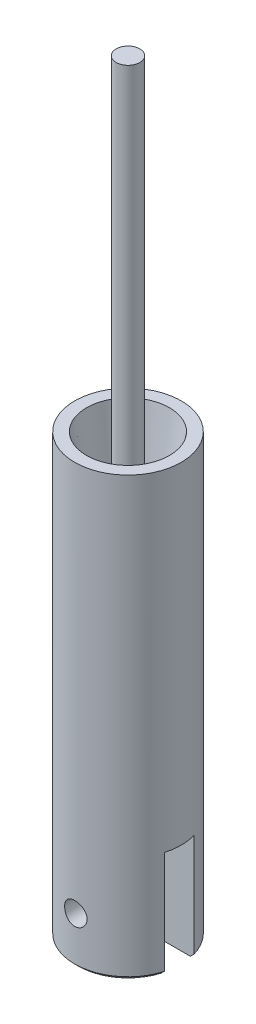
ISO-10303-21;
HEADER;
FILE_DESCRIPTION(('STEP AP214'),'2;1');
FILE_NAME('part.step','',(''),(''),'','','');
FILE_SCHEMA(('AUTOMOTIVE_DESIGN { 1 0 10303 214 1 1 1 1 }'));
ENDSEC;
DATA;
#1=APPLICATION_CONTEXT('core data for automotive mechanical design processes');
#2=APPLICATION_PROTOCOL_DEFINITION('international standard','automotive_design',2000,#1);
#3=PRODUCT_CONTEXT('',#1,'mechanical');
#4=PRODUCT('Part','Part','',(#3));
#5=PRODUCT_RELATED_PRODUCT_CATEGORY('part','',(#4));
#6=PRODUCT_DEFINITION_FORMATION('','',#4);
#7=PRODUCT_DEFINITION_CONTEXT('part definition',#1,'design');
#8=PRODUCT_DEFINITION('design','',#6,#7);
#9=PRODUCT_DEFINITION_SHAPE('','',#8);
#10=(LENGTH_UNIT() NAMED_UNIT(*) SI_UNIT(.MILLI.,.METRE.));
#11=(NAMED_UNIT(*) PLANE_ANGLE_UNIT() SI_UNIT($,.RADIAN.));
#12=(NAMED_UNIT(*) SI_UNIT($,.STERADIAN.) SOLID_ANGLE_UNIT());
#13=UNCERTAINTY_MEASURE_WITH_UNIT(LENGTH_MEASURE(1.E-05),#10,'distance_accuracy_value','');
#14=(GEOMETRIC_REPRESENTATION_CONTEXT(3) GLOBAL_UNCERTAINTY_ASSIGNED_CONTEXT((#13)) GLOBAL_UNIT_ASSIGNED_CONTEXT((#10,
#11,#12)) REPRESENTATION_CONTEXT('',''));
#15=CARTESIAN_POINT('',(0.,0.,0.));
#16=DIRECTION('',(0.,0.,1.));
#17=DIRECTION('',(1.,0.,0.));
#18=AXIS2_PLACEMENT_3D('',#15,#16,#17);
#19=CARTESIAN_POINT('',(0.,-28.,0.));
#20=DIRECTION('',(0.,-1.,0.));
#21=DIRECTION('',(0.,0.,-1.));
#22=AXIS2_PLACEMENT_3D('',#19,#20,#21);
#23=PLANE('',#22);
#24=CARTESIAN_POINT('',(0.,-28.,0.));
#25=DIRECTION('',(0.,-1.,0.));
#26=DIRECTION('',(0.,0.,-1.));
#27=AXIS2_PLACEMENT_3D('',#24,#25,#26);
#28=CIRCLE('',#27,4.5);
#29=CARTESIAN_POINT('',(4.32290411644765,-28.,-1.25));
#30=VERTEX_POINT('',#29);
#31=CARTESIAN_POINT('',(4.32290411644765,-28.,1.25));
#32=VERTEX_POINT('',#31);
#33=EDGE_CURVE('E92',#30,#32,#28,.T.);
#34=ORIENTED_EDGE('',*,*,#33,.T.);
#35=DIRECTION('',(1.,0.,0.));
#36=VECTOR('',#35,1.);
#37=CARTESIAN_POINT('',(4.32290411644765,-28.,1.25));
#38=LINE('',#37,#36);
#39=CARTESIAN_POINT('',(-4.32290411644765,-28.,1.25));
#40=VERTEX_POINT('',#39);
#41=EDGE_CURVE('E101',#40,#32,#38,.T.);
#42=ORIENTED_EDGE('',*,*,#41,.F.);
#43=CARTESIAN_POINT('',(-4.32290411644765,-28.,-1.25));
#44=VERTEX_POINT('',#43);
#45=EDGE_CURVE('E111',#40,#44,#28,.T.);
#46=ORIENTED_EDGE('',*,*,#45,.T.);
#47=DIRECTION('',(1.,0.,0.));
#48=VECTOR('',#47,1.);
#49=CARTESIAN_POINT('',(-4.32290411644765,-28.,-1.25));
#50=LINE('',#49,#48);
#51=EDGE_CURVE('E110',#44,#30,#50,.T.);
#52=ORIENTED_EDGE('',*,*,#51,.T.);
#53=EDGE_LOOP('',(#34,#42,#46,#52));
#54=FACE_BOUND('',#53,.T.);
#55=ADVANCED_FACE('F34',(#54),#23,.T.);
#56=CARTESIAN_POINT('',(0.,-37.,0.));
#57=DIRECTION('',(0.,1.,0.));
#58=DIRECTION('',(0.,0.,1.));
#59=AXIS2_PLACEMENT_3D('',#56,#57,#58);
#60=CYLINDRICAL_SURFACE('',#59,4.5);
#61=CARTESIAN_POINT('',(0.,-32.05,-4.5));
#62=CARTESIAN_POINT('',(0.0527347408442873,-32.050001861623,-4.49999902381892));
#63=CARTESIAN_POINT('',(0.105492400826645,-32.0544058083861,-4.49906355636003));
#64=CARTESIAN_POINT('',(0.209512205038369,-32.0718887442847,-4.49542209361494));
#65=CARTESIAN_POINT('',(0.260773200864107,-32.0849742212078,-4.49271477422796));
#66=CARTESIAN_POINT('',(0.360281066685506,-32.1193945247813,-4.4858314108215));
#67=CARTESIAN_POINT('',(0.408530919971097,-32.1407210309353,-4.48165684857655));
#68=CARTESIAN_POINT('',(0.500765275370437,-32.190992294336,-4.47229090808337));
#69=CARTESIAN_POINT('',(0.5447499471374,-32.2199367483983,-4.46709957030354));
#70=CARTESIAN_POINT('',(0.627867794623016,-32.285082273599,-4.45618278607622));
#71=CARTESIAN_POINT('',(0.666927778187089,-32.3213756914292,-4.45045109613084));
#72=CARTESIAN_POINT('',(0.738453199761297,-32.3999905428374,-4.43914418760797));
#73=CARTESIAN_POINT('',(0.770918081148691,-32.4423124847067,-4.43356898227188));
#74=CARTESIAN_POINT('',(0.828649922161768,-32.5323180759938,-4.42314498819048));
#75=CARTESIAN_POINT('',(0.853839850645984,-32.5800521459126,-4.41830421402621));
#76=CARTESIAN_POINT('',(0.895812884450986,-32.679194651764,-4.40998640819146));
#77=CARTESIAN_POINT('',(0.912596921463348,-32.7306026797605,-4.40650922539262));
#78=CARTESIAN_POINT('',(0.9370416193333,-32.8348425079871,-4.40137572254666));
#79=CARTESIAN_POINT('',(0.944831387270011,-32.8876427377983,-4.3996936619672));
#80=CARTESIAN_POINT('',(0.951467691786891,-32.9938253976427,-4.39826347667246));
#81=CARTESIAN_POINT('',(0.950315250055807,-33.0472077604686,-4.39851513102127));
#82=CARTESIAN_POINT('',(0.939203949079961,-33.1520859452551,-4.40090060295087));
#83=CARTESIAN_POINT('',(0.929394240020409,-33.2035984031507,-4.40300254168397));
#84=CARTESIAN_POINT('',(0.901482801655349,-33.3042295778745,-4.40880143157992));
#85=CARTESIAN_POINT('',(0.883380635826624,-33.3533481685364,-4.41249846670964));
#86=CARTESIAN_POINT('',(0.839258919149455,-33.4482209922465,-4.42110289130809));
#87=CARTESIAN_POINT('',(0.813181283666046,-33.493947378465,-4.42601910855786));
#88=CARTESIAN_POINT('',(0.753889775276874,-33.5804307190455,-4.43650244554185));
#89=CARTESIAN_POINT('',(0.720674992922678,-33.6211870390603,-4.44206964818641));
#90=CARTESIAN_POINT('',(0.647258737666239,-33.6974328461976,-4.45336500836213));
#91=CARTESIAN_POINT('',(0.606930238015697,-33.7327999876785,-4.45909415173223));
#92=CARTESIAN_POINT('',(0.52085072977631,-33.796288004782,-4.46996571419661));
#93=CARTESIAN_POINT('',(0.475099635574184,-33.8244087659747,-4.47510812402487));
#94=CARTESIAN_POINT('',(0.379329918590807,-33.8726328201803,-4.48424174826901));
#95=CARTESIAN_POINT('',(0.329303431997137,-33.8927209358827,-4.48823077953011));
#96=CARTESIAN_POINT('',(0.226482381796747,-33.9241726023944,-4.49459183535642));
#97=CARTESIAN_POINT('',(0.173688193628573,-33.9355373332758,-4.49696407863073));
#98=CARTESIAN_POINT('',(0.0678806118773591,-33.949043654834,-4.49979342030265));
#99=CARTESIAN_POINT('',(0.0148894691117474,-33.9513524966353,-4.50028524339463));
#100=CARTESIAN_POINT('',(-0.0907213365006826,-33.9471336181227,-4.49939528026475));
#101=CARTESIAN_POINT('',(-0.143341022524975,-33.9406064541291,-4.49801361199904));
#102=CARTESIAN_POINT('',(-0.24616715955834,-33.9190396546589,-4.4935537489183));
#103=CARTESIAN_POINT('',(-0.296392661455151,-33.9040869491067,-4.4904928874432));
#104=CARTESIAN_POINT('',(-0.393623068492928,-33.8661893831427,-4.48301692161414));
#105=CARTESIAN_POINT('',(-0.440627712180065,-33.843243874831,-4.47860170747926));
#106=CARTESIAN_POINT('',(-0.530779460605719,-33.7896580197439,-4.46882074452188));
#107=CARTESIAN_POINT('',(-0.573866229974225,-33.7589183998591,-4.46344301814203));
#108=CARTESIAN_POINT('',(-0.654329912739068,-33.6907485395366,-4.45235948283664));
#109=CARTESIAN_POINT('',(-0.6917061377545,-33.6533174936553,-4.44665363447139));
#110=CARTESIAN_POINT('',(-0.760342482767523,-33.5720622834905,-4.43543819394321));
#111=CARTESIAN_POINT('',(-0.791487189802193,-33.52813981237,-4.42993362083053));
#112=CARTESIAN_POINT('',(-0.845957987093679,-33.4355890357497,-4.41985582834606));
#113=CARTESIAN_POINT('',(-0.869284406650516,-33.3869609285588,-4.41528256975124));
#114=CARTESIAN_POINT('',(-0.907304742749541,-33.2866347124308,-4.4076268697261));
#115=CARTESIAN_POINT('',(-0.922045815271617,-33.2349551243955,-4.40453630130223));
#116=CARTESIAN_POINT('',(-0.942617342868014,-33.1297794461501,-4.40018012319066));
#117=CARTESIAN_POINT('',(-0.948449111665153,-33.0762836249423,-4.39891424444461));
#118=CARTESIAN_POINT('',(-0.950983582994045,-32.970155588911,-4.39836689581349));
#119=CARTESIAN_POINT('',(-0.947869005805073,-32.9175278590786,-4.39904570681121));
#120=CARTESIAN_POINT('',(-0.933005507317616,-32.8135649712725,-4.40222187651559));
#121=CARTESIAN_POINT('',(-0.921256673713711,-32.7622298001763,-4.4047192167522));
#122=CARTESIAN_POINT('',(-0.889543673704298,-32.662442359925,-4.41123235518308));
#123=CARTESIAN_POINT('',(-0.869604359377172,-32.6139818729069,-4.41524355695755));
#124=CARTESIAN_POINT('',(-0.822098427592028,-32.5210662898834,-4.4243345824775));
#125=CARTESIAN_POINT('',(-0.794531079030222,-32.4766115783505,-4.42941450864296));
#126=CARTESIAN_POINT('',(-0.731938052689251,-32.392064880358,-4.44019045646729));
#127=CARTESIAN_POINT('',(-0.696781422110547,-32.3520710762636,-4.44589629700218));
#128=CARTESIAN_POINT('',(-0.620275312095847,-32.2784905136574,-4.45721335960146));
#129=CARTESIAN_POINT('',(-0.578924407586101,-32.2449052335639,-4.46282455956119));
#130=CARTESIAN_POINT('',(-0.490610874868227,-32.184714339174,-4.47339916788946));
#131=CARTESIAN_POINT('',(-0.443587299080455,-32.158196578871,-4.47835406892243));
#132=CARTESIAN_POINT('',(-0.345657434212576,-32.113482629725,-4.48697318488877));
#133=CARTESIAN_POINT('',(-0.294754548328074,-32.095279242806,-4.49063851561925));
#134=CARTESIAN_POINT('',(-0.203144548498003,-32.0710729949579,-4.49558714857658));
#135=CARTESIAN_POINT('',(-0.162944299001343,-32.0631852812716,-4.49723195618293));
#136=CARTESIAN_POINT('',(-0.0818339487706766,-32.0526481630786,-4.4994387396613));
#137=CARTESIAN_POINT('',(-0.0409238756417815,-32.04999855532,-4.5000007575483));
#138=CARTESIAN_POINT('',(0.,-32.05,-4.5));
#139=B_SPLINE_CURVE_WITH_KNOTS('',3,(#61,#62,#63,#64,#65,#66,#67,#68,#69,#70,#71,#72,#73,#74,
#75,#76,#77,#78,#79,#80,#81,#82,#83,#84,#85,#86,#87,#88,#89,#90,#91,#92,#93,#94,#95,#96,#97,#98,
#99,#100,#101,#102,#103,#104,#105,#106,#107,#108,#109,#110,#111,#112,#113,#114,#115,#116,#117,
#118,#119,#120,#121,#122,#123,#124,#125,#126,#127,#128,#129,#130,#131,#132,#133,#134,#135,#136,
#137,#138),.UNSPECIFIED.,.T.,.F.,(4,2,2,2,2,2,2,2,2,2,2,2,2,2,2,2,2,2,2,2,2,2,2,2,2,2,2,2,2,2,2,
2,2,2,2,2,2,2,4),(0.,0.158054461091979,0.316227170986091,0.474240598441141,0.632247738123588,
0.792379618124057,0.952525007551037,1.11430866104739,1.27607437880848,1.43548799437261,
1.59488339646324,1.75158514996226,1.90829515334638,2.0661747944624,2.22407456527886,
2.38514849511714,2.54622496836982,2.70760436613128,2.86896192914788,3.02732498010878,
3.18567806089956,3.34242649759173,3.49918764333372,3.65805564138118,3.81694277518011,
3.97854469535863,4.14013980813784,4.30083876083485,4.46151401535396,4.61893111366626,
4.77634661318015,4.93328795994318,5.09024435385686,5.2501632540746,5.41011900239368,
5.57197904575767,5.73369869374658,5.85635886053987,5.9790142677117),.UNSPECIFIED.);
#140=CARTESIAN_POINT('',(0.,-32.05,-4.5));
#141=VERTEX_POINT('',#140);
#142=EDGE_CURVE('E132',#141,#141,#139,.T.);
#143=ORIENTED_EDGE('',*,*,#142,.F.);
#144=EDGE_LOOP('',(#143));
#145=FACE_BOUND('',#144,.T.);
#146=CARTESIAN_POINT('',(0.,-33.95,4.5));
#147=CARTESIAN_POINT('',(0.0527347408442873,-33.949998138377,4.49999902381892));
#148=CARTESIAN_POINT('',(0.105492400826645,-33.9455941916139,4.49906355636003));
#149=CARTESIAN_POINT('',(0.209512205038369,-33.9281112557153,4.49542209361494));
#150=CARTESIAN_POINT('',(0.260773200864107,-33.9150257787922,4.49271477422796));
#151=CARTESIAN_POINT('',(0.360281066685507,-33.8806054752187,4.4858314108215));
#152=CARTESIAN_POINT('',(0.408530919971098,-33.8592789690647,4.48165684857655));
#153=CARTESIAN_POINT('',(0.500765275370439,-33.809007705664,4.47229090808337));
#154=CARTESIAN_POINT('',(0.544749947137402,-33.7800632516017,4.46709957030354));
#155=CARTESIAN_POINT('',(0.627867794623018,-33.714917726401,4.45618278607622));
#156=CARTESIAN_POINT('',(0.666927778187091,-33.6786243085708,4.45045109613084));
#157=CARTESIAN_POINT('',(0.738453199761299,-33.6000094571626,4.43914418760797));
#158=CARTESIAN_POINT('',(0.770918081148695,-33.5576875152933,4.43356898227188));
#159=CARTESIAN_POINT('',(0.828649922161772,-33.4676819240062,4.42314498819048));
#160=CARTESIAN_POINT('',(0.853839850645989,-33.4199478540874,4.4183042140262));
#161=CARTESIAN_POINT('',(0.895812884450989,-33.320805348236,4.40998640819145));
#162=CARTESIAN_POINT('',(0.91259692146335,-33.2693973202395,4.40650922539262));
#163=CARTESIAN_POINT('',(0.9370416193333,-33.1651574920129,4.40137572254666));
#164=CARTESIAN_POINT('',(0.944831387270011,-33.1123572622017,4.3996936619672));
#165=CARTESIAN_POINT('',(0.951467691786891,-33.0061746023573,4.39826347667246));
#166=CARTESIAN_POINT('',(0.950315250055807,-32.9527922395314,4.39851513102127));
#167=CARTESIAN_POINT('',(0.939203949079962,-32.8479140547449,4.40090060295087));
#168=CARTESIAN_POINT('',(0.92939424002041,-32.7964015968493,4.40300254168397));
#169=CARTESIAN_POINT('',(0.901482801655349,-32.6957704221255,4.40880143157992));
#170=CARTESIAN_POINT('',(0.883380635826624,-32.6466518314636,4.41249846670964));
#171=CARTESIAN_POINT('',(0.839258919149455,-32.5517790077535,4.42110289130809));
#172=CARTESIAN_POINT('',(0.813181283666047,-32.506052621535,4.42601910855786));
#173=CARTESIAN_POINT('',(0.753889775276874,-32.4195692809545,4.43650244554185));
#174=CARTESIAN_POINT('',(0.720674992922678,-32.3788129609397,4.44206964818641));
#175=CARTESIAN_POINT('',(0.647258737666239,-32.3025671538024,4.45336500836213));
#176=CARTESIAN_POINT('',(0.606930238015697,-32.2672000123215,4.45909415173223));
#177=CARTESIAN_POINT('',(0.52085072977631,-32.203711995218,4.46996571419661));
#178=CARTESIAN_POINT('',(0.475099635574184,-32.1755912340253,4.47510812402487));
#179=CARTESIAN_POINT('',(0.379329918590806,-32.1273671798197,4.48424174826901));
#180=CARTESIAN_POINT('',(0.329303431997136,-32.1072790641173,4.48823077953011));
#181=CARTESIAN_POINT('',(0.226482381796746,-32.0758273976056,4.49459183535642));
#182=CARTESIAN_POINT('',(0.173688193628573,-32.0644626667242,4.49696407863073));
#183=CARTESIAN_POINT('',(0.0678806118773592,-32.050956345166,4.49979342030265));
#184=CARTESIAN_POINT('',(0.0148894691117475,-32.0486475033647,4.50028524339463));
#185=CARTESIAN_POINT('',(-0.0907213365006826,-32.0528663818773,4.49939528026475));
#186=CARTESIAN_POINT('',(-0.143341022524975,-32.0593935458709,4.49801361199904));
#187=CARTESIAN_POINT('',(-0.24616715955834,-32.0809603453411,4.4935537489183));
#188=CARTESIAN_POINT('',(-0.296392661455151,-32.0959130508933,4.4904928874432));
#189=CARTESIAN_POINT('',(-0.393623068492928,-32.1338106168573,4.48301692161414));
#190=CARTESIAN_POINT('',(-0.440627712180065,-32.156756125169,4.47860170747926));
#191=CARTESIAN_POINT('',(-0.530779460605719,-32.2103419802561,4.46882074452188));
#192=CARTESIAN_POINT('',(-0.573866229974225,-32.2410816001409,4.46344301814203));
#193=CARTESIAN_POINT('',(-0.654329912739068,-32.3092514604634,4.45235948283664));
#194=CARTESIAN_POINT('',(-0.6917061377545,-32.3466825063447,4.44665363447139));
#195=CARTESIAN_POINT('',(-0.760342482767523,-32.4279377165095,4.43543819394321));
#196=CARTESIAN_POINT('',(-0.791487189802193,-32.47186018763,4.42993362083053));
#197=CARTESIAN_POINT('',(-0.845957987093679,-32.5644109642503,4.41985582834606));
#198=CARTESIAN_POINT('',(-0.869284406650516,-32.6130390714412,4.41528256975124));
#199=CARTESIAN_POINT('',(-0.90730474274954,-32.7133652875692,4.4076268697261));
#200=CARTESIAN_POINT('',(-0.922045815271616,-32.7650448756045,4.40453630130223));
#201=CARTESIAN_POINT('',(-0.942617342868014,-32.8702205538499,4.40018012319066));
#202=CARTESIAN_POINT('',(-0.948449111665153,-32.9237163750577,4.39891424444461));
#203=CARTESIAN_POINT('',(-0.950983582994045,-33.029844411089,4.39836689581349));
#204=CARTESIAN_POINT('',(-0.947869005805073,-33.0824721409214,4.39904570681121));
#205=CARTESIAN_POINT('',(-0.933005507317616,-33.1864350287275,4.40222187651559));
#206=CARTESIAN_POINT('',(-0.921256673713711,-33.2377701998237,4.4047192167522));
#207=CARTESIAN_POINT('',(-0.889543673704298,-33.337557640075,4.41123235518308));
#208=CARTESIAN_POINT('',(-0.869604359377172,-33.3860181270931,4.41524355695755));
#209=CARTESIAN_POINT('',(-0.822098427592028,-33.4789337101166,4.4243345824775));
#210=CARTESIAN_POINT('',(-0.794531079030222,-33.5233884216495,4.42941450864296));
#211=CARTESIAN_POINT('',(-0.731938052689251,-33.607935119642,4.44019045646729));
#212=CARTESIAN_POINT('',(-0.696781422110547,-33.6479289237364,4.44589629700218));
#213=CARTESIAN_POINT('',(-0.620275312095847,-33.7215094863426,4.45721335960146));
#214=CARTESIAN_POINT('',(-0.578924407586101,-33.7550947664361,4.46282455956119));
#215=CARTESIAN_POINT('',(-0.490610874868227,-33.815285660826,4.47339916788946));
#216=CARTESIAN_POINT('',(-0.443587299080455,-33.841803421129,4.47835406892243));
#217=CARTESIAN_POINT('',(-0.345657434212576,-33.886517370275,4.48697318488877));
#218=CARTESIAN_POINT('',(-0.294754548328074,-33.904720757194,4.49063851561925));
#219=CARTESIAN_POINT('',(-0.203144548498003,-33.9289270050421,4.49558714857658));
#220=CARTESIAN_POINT('',(-0.162944299001343,-33.9368147187284,4.49723195618293));
#221=CARTESIAN_POINT('',(-0.0818339487706764,-33.9473518369214,4.4994387396613));
#222=CARTESIAN_POINT('',(-0.0409238756417814,-33.95000144468,4.5000007575483));
#223=CARTESIAN_POINT('',(0.,-33.95,4.5));
#224=B_SPLINE_CURVE_WITH_KNOTS('',3,(#146,#147,#148,#149,#150,#151,#152,#153,#154,#155,#156,
#157,#158,#159,#160,#161,#162,#163,#164,#165,#166,#167,#168,#169,#170,#171,#172,#173,#174,#175,
#176,#177,#178,#179,#180,#181,#182,#183,#184,#185,#186,#187,#188,#189,#190,#191,#192,#193,#194,
#195,#196,#197,#198,#199,#200,#201,#202,#203,#204,#205,#206,#207,#208,#209,#210,#211,#212,#213,
#214,#215,#216,#217,#218,#219,#220,#221,#222,#223),.UNSPECIFIED.,.T.,.F.,(4,2,2,2,2,2,2,2,2,2,2,
2,2,2,2,2,2,2,2,2,2,2,2,2,2,2,2,2,2,2,2,2,2,2,2,2,2,2,4),(0.,0.158054461091979,
0.316227170986091,0.474240598441142,0.63224773812359,0.792379618124059,0.952525007551045,
1.11430866104741,1.27607437880848,1.43548799437261,1.59488339646323,1.75158514996226,
1.90829515334638,2.0661747944624,2.22407456527886,2.38514849511714,2.54622496836982,
2.70760436613129,2.86896192914788,3.02732498010878,3.18567806089956,3.34242649759173,
3.49918764333372,3.65805564138118,3.81694277518011,3.97854469535863,4.14013980813784,
4.30083876083485,4.46151401535396,4.61893111366626,4.77634661318015,4.93328795994318,
5.09024435385686,5.2501632540746,5.41011900239368,5.57197904575767,5.73369869374658,
5.85635886053987,5.9790142677117),.UNSPECIFIED.);
#225=CARTESIAN_POINT('',(0.,-33.95,4.5));
#226=VERTEX_POINT('',#225);
#227=EDGE_CURVE('E125',#226,#226,#224,.T.);
#228=ORIENTED_EDGE('',*,*,#227,.F.);
#229=EDGE_LOOP('',(#228));
#230=FACE_BOUND('',#229,.T.);
#231=DIRECTION('',(0.,1.,0.));
#232=VECTOR('',#231,1.);
#233=CARTESIAN_POINT('',(-4.32290411644765,-37.,1.25));
#234=LINE('',#233,#232);
#235=CARTESIAN_POINT('',(-4.32290411644765,-36.6999999999956,1.25));
#236=VERTEX_POINT('',#235);
#237=EDGE_CURVE('E97',#236,#40,#234,.T.);
#238=ORIENTED_EDGE('',*,*,#237,.F.);
#239=CARTESIAN_POINT('',(0.,-36.6999999999956,0.));
#240=DIRECTION('',(0.,1.,0.));
#241=DIRECTION('',(0.,0.,1.));
#242=AXIS2_PLACEMENT_3D('',#239,#240,#241);
#243=CIRCLE('',#242,4.5);
#244=CARTESIAN_POINT('',(4.32290411644765,-36.6999999999956,1.25));
#245=VERTEX_POINT('',#244);
#246=EDGE_CURVE('E94',#236,#245,#243,.T.);
#247=ORIENTED_EDGE('',*,*,#246,.T.);
#248=DIRECTION('',(0.,1.,0.));
#249=VECTOR('',#248,1.);
#250=CARTESIAN_POINT('',(4.32290411644765,-37.,1.25));
#251=LINE('',#250,#249);
#252=EDGE_CURVE('E85',#245,#32,#251,.T.);
#253=ORIENTED_EDGE('',*,*,#252,.T.);
#254=ORIENTED_EDGE('',*,*,#33,.F.);
#255=DIRECTION('',(0.,-1.,0.));
#256=VECTOR('',#255,1.);
#257=CARTESIAN_POINT('',(4.32290411644765,-28.,-1.25));
#258=LINE('',#257,#256);
#259=CARTESIAN_POINT('',(4.32290411644765,-36.6999999999956,-1.25));
#260=VERTEX_POINT('',#259);
#261=EDGE_CURVE('E119',#30,#260,#258,.T.);
#262=ORIENTED_EDGE('',*,*,#261,.T.);
#263=CARTESIAN_POINT('',(0.,-36.6999999999956,0.));
#264=DIRECTION('',(0.,-1.,0.));
#265=DIRECTION('',(0.,0.,-1.));
#266=AXIS2_PLACEMENT_3D('',#263,#264,#265);
#267=CIRCLE('',#266,4.5);
#268=CARTESIAN_POINT('',(-4.32290411644765,-36.6999999999956,-1.25));
#269=VERTEX_POINT('',#268);
#270=EDGE_CURVE('E184',#260,#269,#267,.F.);
#271=ORIENTED_EDGE('',*,*,#270,.T.);
#272=DIRECTION('',(0.,-1.,0.));
#273=VECTOR('',#272,1.);
#274=CARTESIAN_POINT('',(-4.32290411644765,-28.,-1.25));
#275=LINE('',#274,#273);
#276=EDGE_CURVE('E113',#44,#269,#275,.T.);
#277=ORIENTED_EDGE('',*,*,#276,.F.);
#278=ORIENTED_EDGE('',*,*,#45,.F.);
#279=EDGE_LOOP('',(#238,#247,#253,#254,#262,#271,#277,#278));
#280=FACE_BOUND('',#279,.T.);
#281=CARTESIAN_POINT('',(0.,0.,0.));
#282=DIRECTION('',(0.,1.,0.));
#283=DIRECTION('',(0.,0.,1.));
#284=AXIS2_PLACEMENT_3D('',#281,#282,#283);
#285=CIRCLE('',#284,4.5);
#286=CARTESIAN_POINT('',(0.,0.,4.5));
#287=VERTEX_POINT('',#286);
#288=EDGE_CURVE('E121',#287,#287,#285,.T.);
#289=ORIENTED_EDGE('',*,*,#288,.F.);
#290=EDGE_LOOP('',(#289));
#291=FACE_BOUND('',#290,.T.);
#292=ADVANCED_FACE('F88',(#145,#230,#280,#291),#60,.T.);
#293=CARTESIAN_POINT('',(4.5,-37.,0.));
#294=DIRECTION('',(0.,-1.,0.));
#295=DIRECTION('',(0.,0.,-1.));
#296=AXIS2_PLACEMENT_3D('',#293,#294,#295);
#297=PLANE('',#296);
#298=DIRECTION('',(1.,0.,0.));
#299=VECTOR('',#298,1.);
#300=CARTESIAN_POINT('',(-4.32290411644765,-37.,-1.25));
#301=LINE('',#300,#299);
#302=CARTESIAN_POINT('',(-4.00967579736351,-37.,-1.25));
#303=VERTEX_POINT('',#302);
#304=CARTESIAN_POINT('',(4.00967579736351,-37.,-1.25));
#305=VERTEX_POINT('',#304);
#306=EDGE_CURVE('E115',#303,#305,#301,.T.);
#307=ORIENTED_EDGE('',*,*,#306,.F.);
#308=CARTESIAN_POINT('',(0.,-37.,0.));
#309=DIRECTION('',(0.,-1.,0.));
#310=DIRECTION('',(0.,0.,-1.));
#311=AXIS2_PLACEMENT_3D('',#308,#309,#310);
#312=CIRCLE('',#311,4.19999999999556);
#313=EDGE_CURVE('E11',#303,#305,#312,.T.);
#314=ORIENTED_EDGE('',*,*,#313,.T.);
#315=EDGE_LOOP('',(#307,#314));
#316=FACE_BOUND('',#315,.T.);
#317=ADVANCED_FACE('F201',(#316),#297,.T.);
#318=CARTESIAN_POINT('',(0.,0.,0.));
#319=DIRECTION('',(0.,1.,0.));
#320=DIRECTION('',(0.,0.,1.));
#321=AXIS2_PLACEMENT_3D('',#318,#319,#320);
#322=PLANE('',#321);
#323=CARTESIAN_POINT('',(0.,0.,0.));
#324=DIRECTION('',(0.,1.,0.));
#325=DIRECTION('',(0.,0.,1.));
#326=AXIS2_PLACEMENT_3D('',#323,#324,#325);
#327=CIRCLE('',#326,3.50000000000251);
#328=CARTESIAN_POINT('',(0.,0.,3.50000000000251));
#329=VERTEX_POINT('',#328);
#330=EDGE_CURVE('E226',#329,#329,#327,.T.);
#331=ORIENTED_EDGE('',*,*,#330,.F.);
#332=EDGE_LOOP('',(#331));
#333=FACE_BOUND('',#332,.T.);
#334=ORIENTED_EDGE('',*,*,#288,.T.);
#335=EDGE_LOOP('',(#334));
#336=FACE_BOUND('',#335,.T.);
#337=ADVANCED_FACE('F206',(#333,#336),#322,.T.);
#338=CARTESIAN_POINT('',(-4.32290411644765,-28.,-1.25));
#339=DIRECTION('',(0.,0.,-1.));
#340=DIRECTION('',(-1.,0.,0.));
#341=AXIS2_PLACEMENT_3D('',#338,#339,#340);
#342=PLANE('',#341);
#343=CARTESIAN_POINT('',(0.,-33.,-1.25));
#344=DIRECTION('',(0.,0.,1.));
#345=DIRECTION('',(1.,0.,0.));
#346=AXIS2_PLACEMENT_3D('',#343,#344,#345);
#347=CIRCLE('',#346,0.949999999999987);
#348=CARTESIAN_POINT('',(0.949999999999987,-33.,-1.25));
#349=VERTEX_POINT('',#348);
#350=EDGE_CURVE('E216',#349,#349,#347,.T.);
#351=ORIENTED_EDGE('',*,*,#350,.F.);
#352=EDGE_LOOP('',(#351));
#353=FACE_BOUND('',#352,.T.);
#354=ORIENTED_EDGE('',*,*,#276,.T.);
#355=CARTESIAN_POINT('',(-4.32290411644764,-36.6999999999956,-1.25));
#356=CARTESIAN_POINT('',(-4.2707770264496,-36.7500810507152,-1.25));
#357=CARTESIAN_POINT('',(-4.21861112207015,-36.8001215755567,-1.25));
#358=CARTESIAN_POINT('',(-4.11420168237866,-36.9001215755616,-1.25));
#359=CARTESIAN_POINT('',(-4.06195814706341,-36.9500810507216,-1.25));
#360=CARTESIAN_POINT('',(-4.00967579736351,-37.,-1.25));
#361=B_SPLINE_CURVE_WITH_KNOTS('',3,(#355,#356,#357,#358,#359,#360),.UNSPECIFIED.,.F.,.F.,(4,2,
4),(0.,0.216859450693915,0.433718910401023),.UNSPECIFIED.);
#362=EDGE_CURVE('E43',#269,#303,#361,.T.);
#363=ORIENTED_EDGE('',*,*,#362,.T.);
#364=ORIENTED_EDGE('',*,*,#306,.T.);
#365=CARTESIAN_POINT('',(4.00967579736351,-37.,-1.25));
#366=CARTESIAN_POINT('',(4.06195814706341,-36.9500810507216,-1.25));
#367=CARTESIAN_POINT('',(4.11420168237866,-36.9001215755616,-1.25));
#368=CARTESIAN_POINT('',(4.21861112207015,-36.8001215755567,-1.25));
#369=CARTESIAN_POINT('',(4.2707770264496,-36.7500810507152,-1.25));
#370=CARTESIAN_POINT('',(4.32290411644764,-36.6999999999956,-1.25));
#371=B_SPLINE_CURVE_WITH_KNOTS('',3,(#365,#366,#367,#368,#369,#370),.UNSPECIFIED.,.F.,.F.,(4,2,
4),(0.,0.216859459707107,0.433718910401023),.UNSPECIFIED.);
#372=EDGE_CURVE('E243',#305,#260,#371,.T.);
#373=ORIENTED_EDGE('',*,*,#372,.T.);
#374=ORIENTED_EDGE('',*,*,#261,.F.);
#375=ORIENTED_EDGE('',*,*,#51,.F.);
#376=EDGE_LOOP('',(#354,#363,#364,#373,#374,#375));
#377=FACE_BOUND('',#376,.T.);
#378=ADVANCED_FACE('F169',(#353,#377),#342,.F.);
#379=CARTESIAN_POINT('',(4.32290411644765,-37.,1.25));
#380=DIRECTION('',(0.,0.,1.));
#381=DIRECTION('',(1.,0.,0.));
#382=AXIS2_PLACEMENT_3D('',#379,#380,#381);
#383=PLANE('',#382);
#384=CARTESIAN_POINT('',(0.,-33.,1.25));
#385=DIRECTION('',(0.,0.,-1.));
#386=DIRECTION('',(-1.,0.,0.));
#387=AXIS2_PLACEMENT_3D('',#384,#385,#386);
#388=CIRCLE('',#387,0.949999999999987);
#389=CARTESIAN_POINT('',(-0.949999999999987,-33.,1.25));
#390=VERTEX_POINT('',#389);
#391=EDGE_CURVE('E214',#390,#390,#388,.T.);
#392=ORIENTED_EDGE('',*,*,#391,.F.);
#393=EDGE_LOOP('',(#392));
#394=FACE_BOUND('',#393,.T.);
#395=DIRECTION('',(1.,0.,0.));
#396=VECTOR('',#395,1.);
#397=CARTESIAN_POINT('',(4.32290411644765,-37.,1.25));
#398=LINE('',#397,#396);
#399=CARTESIAN_POINT('',(-4.00967579736355,-37.,1.25));
#400=VERTEX_POINT('',#399);
#401=CARTESIAN_POINT('',(4.00967579736355,-37.,1.25));
#402=VERTEX_POINT('',#401);
#403=EDGE_CURVE('E98',#400,#402,#398,.T.);
#404=ORIENTED_EDGE('',*,*,#403,.F.);
#405=CARTESIAN_POINT('',(-4.00967579736355,-37.,1.25));
#406=CARTESIAN_POINT('',(-4.06195814706344,-36.9500810507216,1.25));
#407=CARTESIAN_POINT('',(-4.11420168237869,-36.9001215755616,1.25));
#408=CARTESIAN_POINT('',(-4.21861112207016,-36.8001215755568,1.25));
#409=CARTESIAN_POINT('',(-4.27077702644961,-36.7500810507152,1.25));
#410=CARTESIAN_POINT('',(-4.32290411644764,-36.6999999999956,1.25));
#411=B_SPLINE_CURVE_WITH_KNOTS('',3,(#405,#406,#407,#408,#409,#410),.UNSPECIFIED.,.F.,.F.,(4,2,
4),(0.,0.216859459707084,0.433718910400977),.UNSPECIFIED.);
#412=EDGE_CURVE('E179',#400,#236,#411,.T.);
#413=ORIENTED_EDGE('',*,*,#412,.T.);
#414=ORIENTED_EDGE('',*,*,#237,.T.);
#415=ORIENTED_EDGE('',*,*,#41,.T.);
#416=ORIENTED_EDGE('',*,*,#252,.F.);
#417=CARTESIAN_POINT('',(4.32290411644764,-36.6999999999956,1.25));
#418=CARTESIAN_POINT('',(4.27077702644961,-36.7500810507152,1.25));
#419=CARTESIAN_POINT('',(4.21861112207016,-36.8001215755568,1.25));
#420=CARTESIAN_POINT('',(4.11420168237869,-36.9001215755616,1.25));
#421=CARTESIAN_POINT('',(4.06195814706344,-36.9500810507216,1.25));
#422=CARTESIAN_POINT('',(4.00967579736355,-37.,1.25));
#423=B_SPLINE_CURVE_WITH_KNOTS('',3,(#417,#418,#419,#420,#421,#422),.UNSPECIFIED.,.F.,.F.,(4,2,
4),(0.,0.216859450693893,0.433718910400977),.UNSPECIFIED.);
#424=EDGE_CURVE('E174',#245,#402,#423,.T.);
#425=ORIENTED_EDGE('',*,*,#424,.T.);
#426=EDGE_LOOP('',(#404,#413,#414,#415,#416,#425));
#427=FACE_BOUND('',#426,.T.);
#428=ADVANCED_FACE('F103',(#394,#427),#383,.F.);
#429=CARTESIAN_POINT('',(0.,-37.,0.));
#430=DIRECTION('',(0.,1.,0.));
#431=DIRECTION('',(0.,0.,1.));
#432=AXIS2_PLACEMENT_3D('',#429,#430,#431);
#433=PLANE('',#432);
#434=ORIENTED_EDGE('',*,*,#403,.T.);
#435=CARTESIAN_POINT('',(0.,-37.,0.));
#436=DIRECTION('',(0.,1.,0.));
#437=DIRECTION('',(0.,0.,1.));
#438=AXIS2_PLACEMENT_3D('',#435,#436,#437);
#439=CIRCLE('',#438,4.1999999999956);
#440=EDGE_CURVE('E234',#402,#400,#439,.F.);
#441=ORIENTED_EDGE('',*,*,#440,.T.);
#442=EDGE_LOOP('',(#434,#441));
#443=FACE_BOUND('',#442,.T.);
#444=ADVANCED_FACE('F161',(#443),#433,.F.);
#445=CARTESIAN_POINT('',(0.,-6.50000000001683,0.));
#446=DIRECTION('',(0.,-1.,0.));
#447=DIRECTION('',(0.,0.,-1.));
#448=AXIS2_PLACEMENT_3D('',#445,#446,#447);
#449=PLANE('',#448);
#450=CARTESIAN_POINT('',(0.,-6.5,0.));
#451=DIRECTION('',(0.,1.,0.));
#452=DIRECTION('',(0.,0.,1.));
#453=AXIS2_PLACEMENT_3D('',#450,#451,#452);
#454=CIRCLE('',#453,1.);
#455=CARTESIAN_POINT('',(0.,-6.5,1.));
#456=VERTEX_POINT('',#455);
#457=EDGE_CURVE('E219',#456,#456,#454,.T.);
#458=ORIENTED_EDGE('',*,*,#457,.F.);
#459=EDGE_LOOP('',(#458));
#460=FACE_BOUND('',#459,.T.);
#461=CARTESIAN_POINT('',(0.,-6.50000000001683,0.));
#462=DIRECTION('',(0.,1.,0.));
#463=DIRECTION('',(0.,0.,1.));
#464=AXIS2_PLACEMENT_3D('',#461,#462,#463);
#465=CIRCLE('',#464,2.5000000000032);
#466=CARTESIAN_POINT('',(0.,-6.50000000001683,2.5000000000032));
#467=VERTEX_POINT('',#466);
#468=EDGE_CURVE('E106',#467,#467,#465,.T.);
#469=ORIENTED_EDGE('',*,*,#468,.T.);
#470=EDGE_LOOP('',(#469));
#471=FACE_BOUND('',#470,.T.);
#472=ADVANCED_FACE('F157',(#460,#471),#449,.F.);
#473=CARTESIAN_POINT('',(0.,0.,0.));
#474=DIRECTION('',(0.,1.,0.));
#475=DIRECTION('',(0.,0.,1.));
#476=AXIS2_PLACEMENT_3D('',#473,#474,#475);
#477=CONICAL_SURFACE('',#476,3.50000000000251,0.152649328394772);
#478=ORIENTED_EDGE('',*,*,#468,.F.);
#479=EDGE_LOOP('',(#478));
#480=FACE_BOUND('',#479,.T.);
#481=ORIENTED_EDGE('',*,*,#330,.T.);
#482=EDGE_LOOP('',(#481));
#483=FACE_BOUND('',#482,.T.);
#484=ADVANCED_FACE('F153',(#480,#483),#477,.F.);
#485=CARTESIAN_POINT('',(0.,-6.5,0.));
#486=DIRECTION('',(0.,1.,0.));
#487=DIRECTION('',(0.,0.,1.));
#488=AXIS2_PLACEMENT_3D('',#485,#486,#487);
#489=CYLINDRICAL_SURFACE('',#488,1.);
#490=ORIENTED_EDGE('',*,*,#457,.T.);
#491=EDGE_LOOP('',(#490));
#492=FACE_BOUND('',#491,.T.);
#493=CARTESIAN_POINT('',(0.,27.5,0.));
#494=DIRECTION('',(0.,1.,0.));
#495=DIRECTION('',(0.,0.,1.));
#496=AXIS2_PLACEMENT_3D('',#493,#494,#495);
#497=CIRCLE('',#496,1.);
#498=CARTESIAN_POINT('',(0.,27.5,1.));
#499=VERTEX_POINT('',#498);
#500=EDGE_CURVE('E215',#499,#499,#497,.T.);
#501=ORIENTED_EDGE('',*,*,#500,.F.);
#502=EDGE_LOOP('',(#501));
#503=FACE_BOUND('',#502,.T.);
#504=ADVANCED_FACE('F149',(#492,#503),#489,.T.);
#505=CARTESIAN_POINT('',(0.,27.5,0.));
#506=DIRECTION('',(0.,1.,0.));
#507=DIRECTION('',(0.,0.,1.));
#508=AXIS2_PLACEMENT_3D('',#505,#506,#507);
#509=PLANE('',#508);
#510=ORIENTED_EDGE('',*,*,#500,.T.);
#511=EDGE_LOOP('',(#510));
#512=FACE_BOUND('',#511,.T.);
#513=ADVANCED_FACE('F144',(#512),#509,.T.);
#514=CARTESIAN_POINT('',(0.,-33.,1.25));
#515=DIRECTION('',(0.,0.,-1.));
#516=DIRECTION('',(-1.,0.,0.));
#517=AXIS2_PLACEMENT_3D('',#514,#515,#516);
#518=CYLINDRICAL_SURFACE('',#517,0.949999999999987);
#519=ORIENTED_EDGE('',*,*,#227,.T.);
#520=EDGE_LOOP('',(#519));
#521=FACE_BOUND('',#520,.T.);
#522=ORIENTED_EDGE('',*,*,#391,.T.);
#523=EDGE_LOOP('',(#522));
#524=FACE_BOUND('',#523,.T.);
#525=ADVANCED_FACE('F139',(#521,#524),#518,.F.);
#526=CARTESIAN_POINT('',(0.,-33.,-1.25));
#527=DIRECTION('',(0.,0.,1.));
#528=DIRECTION('',(1.,0.,0.));
#529=AXIS2_PLACEMENT_3D('',#526,#527,#528);
#530=CYLINDRICAL_SURFACE('',#529,0.949999999999987);
#531=ORIENTED_EDGE('',*,*,#142,.T.);
#532=EDGE_LOOP('',(#531));
#533=FACE_BOUND('',#532,.T.);
#534=ORIENTED_EDGE('',*,*,#350,.T.);
#535=EDGE_LOOP('',(#534));
#536=FACE_BOUND('',#535,.T.);
#537=ADVANCED_FACE('F143',(#533,#536),#530,.F.);
#538=CARTESIAN_POINT('',(0.,-37.,0.));
#539=DIRECTION('',(0.,1.,0.));
#540=DIRECTION('',(0.,0.,1.));
#541=AXIS2_PLACEMENT_3D('',#538,#539,#540);
#542=CONICAL_SURFACE('',#541,4.1999999999956,0.785398163397441);
#543=ORIENTED_EDGE('',*,*,#424,.F.);
#544=ORIENTED_EDGE('',*,*,#246,.F.);
#545=ORIENTED_EDGE('',*,*,#412,.F.);
#546=ORIENTED_EDGE('',*,*,#440,.F.);
#547=EDGE_LOOP('',(#543,#544,#545,#546));
#548=FACE_BOUND('',#547,.T.);
#549=ADVANCED_FACE('F186',(#548),#542,.T.);
#550=CARTESIAN_POINT('',(0.,-36.6999999999956,0.));
#551=DIRECTION('',(0.,1.,0.));
#552=DIRECTION('',(0.,0.,1.));
#553=AXIS2_PLACEMENT_3D('',#550,#551,#552);
#554=CONICAL_SURFACE('',#553,4.5,0.785398163397453);
#555=ORIENTED_EDGE('',*,*,#372,.F.);
#556=ORIENTED_EDGE('',*,*,#313,.F.);
#557=ORIENTED_EDGE('',*,*,#362,.F.);
#558=ORIENTED_EDGE('',*,*,#270,.F.);
#559=EDGE_LOOP('',(#555,#556,#557,#558));
#560=FACE_BOUND('',#559,.T.);
#561=ADVANCED_FACE('F36',(#560),#554,.T.);
#562=CLOSED_SHELL('',(#55,#292,#317,#337,#378,#428,#444,#472,#484,#504,#513,#525,#537,#549,#561));
#563=MANIFOLD_SOLID_BREP('B2',#562);
#564=ADVANCED_BREP_SHAPE_REPRESENTATION('',(#18,#563),#14);
#565=SHAPE_DEFINITION_REPRESENTATION(#9,#564);
ENDSEC;
END-ISO-10303-21;
